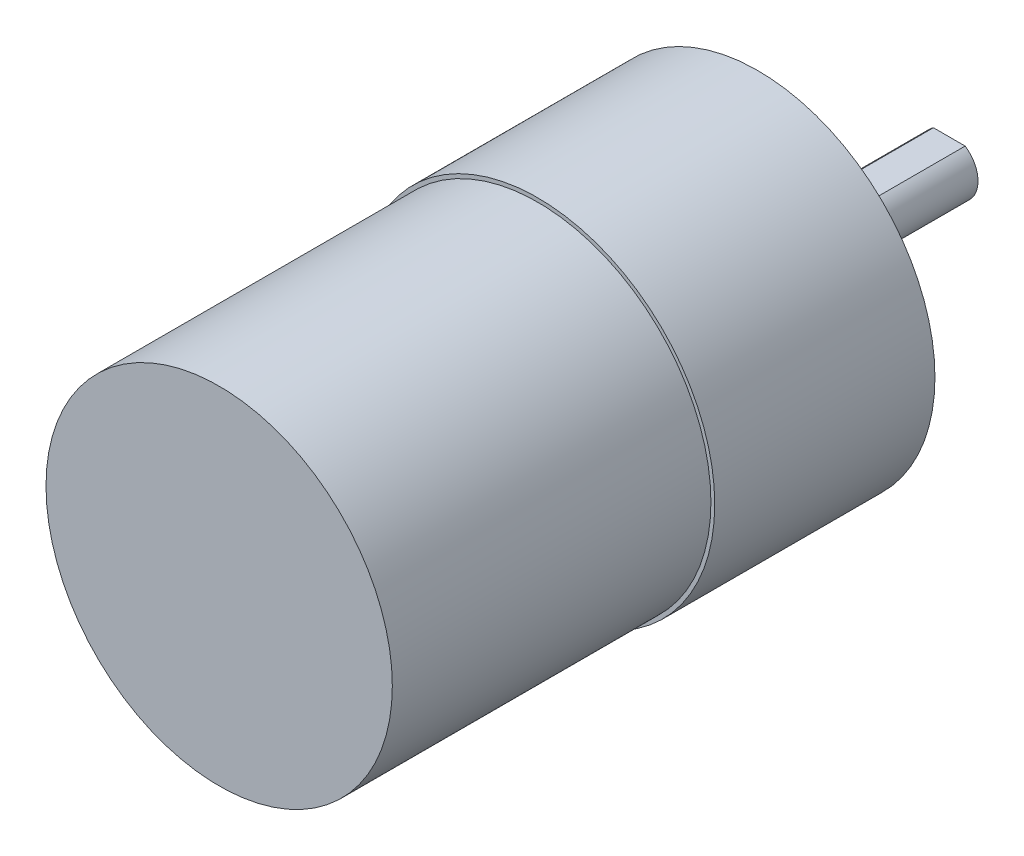
ISO-10303-21;
HEADER;
FILE_DESCRIPTION(('STEP AP214'),'2;1');
FILE_NAME('part.step','',(''),(''),'','','');
FILE_SCHEMA(('AUTOMOTIVE_DESIGN { 1 0 10303 214 1 1 1 1 }'));
ENDSEC;
DATA;
#1=APPLICATION_CONTEXT('core data for automotive mechanical design processes');
#2=APPLICATION_PROTOCOL_DEFINITION('international standard','automotive_design',2000,#1);
#3=PRODUCT_CONTEXT('',#1,'mechanical');
#4=PRODUCT('Part','Part','',(#3));
#5=PRODUCT_RELATED_PRODUCT_CATEGORY('part','',(#4));
#6=PRODUCT_DEFINITION_FORMATION('','',#4);
#7=PRODUCT_DEFINITION_CONTEXT('part definition',#1,'design');
#8=PRODUCT_DEFINITION('design','',#6,#7);
#9=PRODUCT_DEFINITION_SHAPE('','',#8);
#10=(LENGTH_UNIT() NAMED_UNIT(*) SI_UNIT(.MILLI.,.METRE.));
#11=(NAMED_UNIT(*) PLANE_ANGLE_UNIT() SI_UNIT($,.RADIAN.));
#12=(NAMED_UNIT(*) SI_UNIT($,.STERADIAN.) SOLID_ANGLE_UNIT());
#13=UNCERTAINTY_MEASURE_WITH_UNIT(LENGTH_MEASURE(1.E-05),#10,'distance_accuracy_value','');
#14=(GEOMETRIC_REPRESENTATION_CONTEXT(3) GLOBAL_UNCERTAINTY_ASSIGNED_CONTEXT((#13)) GLOBAL_UNIT_ASSIGNED_CONTEXT((#10,
#11,#12)) REPRESENTATION_CONTEXT('',''));
#15=CARTESIAN_POINT('',(0.,0.,0.));
#16=DIRECTION('',(0.,0.,1.));
#17=DIRECTION('',(1.,0.,0.));
#18=AXIS2_PLACEMENT_3D('',#15,#16,#17);
#19=CARTESIAN_POINT('',(0.,0.,23.0161764705882));
#20=DIRECTION('',(0.,0.,-1.));
#21=DIRECTION('',(-1.,0.,0.));
#22=AXIS2_PLACEMENT_3D('',#19,#20,#21);
#23=CYLINDRICAL_SURFACE('',#22,18.5);
#24=CARTESIAN_POINT('',(0.,0.,23.0161764705882));
#25=DIRECTION('',(0.,0.,1.));
#26=DIRECTION('',(1.,0.,0.));
#27=AXIS2_PLACEMENT_3D('',#24,#25,#26);
#28=CIRCLE('',#27,18.5);
#29=CARTESIAN_POINT('',(18.5,0.,23.0161764705882));
#30=VERTEX_POINT('',#29);
#31=EDGE_CURVE('E89',#30,#30,#28,.T.);
#32=ORIENTED_EDGE('',*,*,#31,.F.);
#33=EDGE_LOOP('',(#32));
#34=FACE_BOUND('',#33,.T.);
#35=CARTESIAN_POINT('',(0.,0.,0.));
#36=DIRECTION('',(0.,0.,1.));
#37=DIRECTION('',(1.,0.,0.));
#38=AXIS2_PLACEMENT_3D('',#35,#36,#37);
#39=CIRCLE('',#38,18.5);
#40=CARTESIAN_POINT('',(18.5,0.,0.));
#41=VERTEX_POINT('',#40);
#42=EDGE_CURVE('E37',#41,#41,#39,.T.);
#43=ORIENTED_EDGE('',*,*,#42,.T.);
#44=EDGE_LOOP('',(#43));
#45=FACE_BOUND('',#44,.T.);
#46=ADVANCED_FACE('F34',(#34,#45),#23,.T.);
#47=CARTESIAN_POINT('',(0.,0.,23.0161764705882));
#48=DIRECTION('',(0.,0.,1.));
#49=DIRECTION('',(1.,0.,0.));
#50=AXIS2_PLACEMENT_3D('',#47,#48,#49);
#51=PLANE('',#50);
#52=CARTESIAN_POINT('',(0.,0.,23.0161764705882));
#53=DIRECTION('',(0.,0.,1.));
#54=DIRECTION('',(1.,0.,0.));
#55=AXIS2_PLACEMENT_3D('',#52,#53,#54);
#56=CIRCLE('',#55,18.1);
#57=CARTESIAN_POINT('',(18.1,0.,23.0161764705882));
#58=VERTEX_POINT('',#57);
#59=EDGE_CURVE('E85',#58,#58,#56,.T.);
#60=ORIENTED_EDGE('',*,*,#59,.F.);
#61=EDGE_LOOP('',(#60));
#62=FACE_BOUND('',#61,.T.);
#63=ORIENTED_EDGE('',*,*,#31,.T.);
#64=EDGE_LOOP('',(#63));
#65=FACE_BOUND('',#64,.T.);
#66=ADVANCED_FACE('F100',(#62,#65),#51,.T.);
#67=CARTESIAN_POINT('',(0.,0.,0.));
#68=DIRECTION('',(0.,0.,1.));
#69=DIRECTION('',(1.,0.,0.));
#70=AXIS2_PLACEMENT_3D('',#67,#68,#69);
#71=PLANE('',#70);
#72=CARTESIAN_POINT('',(7.75000000000009,13.4233937586581,0.));
#73=DIRECTION('',(0.,0.,-1.));
#74=DIRECTION('',(-1.,0.,0.));
#75=AXIS2_PLACEMENT_3D('',#72,#73,#74);
#76=CIRCLE('',#75,1.50000000000076);
#77=CARTESIAN_POINT('',(6.24999999999933,13.4233937586581,0.));
#78=VERTEX_POINT('',#77);
#79=EDGE_CURVE('E323',#78,#78,#76,.T.);
#80=ORIENTED_EDGE('',*,*,#79,.F.);
#81=EDGE_LOOP('',(#80));
#82=FACE_BOUND('',#81,.T.);
#83=CARTESIAN_POINT('',(15.4999999999994,-1.08176008225088E-12,0.));
#84=DIRECTION('',(0.,0.,-1.));
#85=DIRECTION('',(-1.,0.,0.));
#86=AXIS2_PLACEMENT_3D('',#83,#84,#85);
#87=CIRCLE('',#86,1.50000000000118);
#88=CARTESIAN_POINT('',(13.9999999999983,-1.08176008225088E-12,0.));
#89=VERTEX_POINT('',#88);
#90=EDGE_CURVE('E322',#89,#89,#87,.T.);
#91=ORIENTED_EDGE('',*,*,#90,.F.);
#92=EDGE_LOOP('',(#91));
#93=FACE_BOUND('',#92,.T.);
#94=CARTESIAN_POINT('',(7.74999999999879,-13.4233937586595,0.));
#95=DIRECTION('',(0.,0.,-1.));
#96=DIRECTION('',(-1.,0.,0.));
#97=AXIS2_PLACEMENT_3D('',#94,#95,#96);
#98=CIRCLE('',#97,1.50000000000096);
#99=CARTESIAN_POINT('',(6.24999999999783,-13.4233937586595,0.));
#100=VERTEX_POINT('',#99);
#101=EDGE_CURVE('E358',#100,#100,#98,.T.);
#102=ORIENTED_EDGE('',*,*,#101,.F.);
#103=EDGE_LOOP('',(#102));
#104=FACE_BOUND('',#103,.T.);
#105=CARTESIAN_POINT('',(-7.75000000000121,-13.4233937586588,0.));
#106=DIRECTION('',(0.,0.,-1.));
#107=DIRECTION('',(-1.,0.,0.));
#108=AXIS2_PLACEMENT_3D('',#105,#106,#107);
#109=CIRCLE('',#108,1.5000000000003);
#110=CARTESIAN_POINT('',(-9.25000000000151,-13.4233937586588,0.));
#111=VERTEX_POINT('',#110);
#112=EDGE_CURVE('E352',#111,#111,#109,.T.);
#113=ORIENTED_EDGE('',*,*,#112,.F.);
#114=EDGE_LOOP('',(#113));
#115=FACE_BOUND('',#114,.T.);
#116=CARTESIAN_POINT('',(-15.5000000000006,4.21937952614402E-13,0.));
#117=DIRECTION('',(0.,0.,-1.));
#118=DIRECTION('',(-1.,0.,0.));
#119=AXIS2_PLACEMENT_3D('',#116,#117,#118);
#120=CIRCLE('',#119,1.49999999999983);
#121=CARTESIAN_POINT('',(-17.0000000000004,4.21937952614402E-13,0.));
#122=VERTEX_POINT('',#121);
#123=EDGE_CURVE('E343',#122,#122,#120,.T.);
#124=ORIENTED_EDGE('',*,*,#123,.F.);
#125=EDGE_LOOP('',(#124));
#126=FACE_BOUND('',#125,.T.);
#127=CARTESIAN_POINT('',(-7.74999999999992,13.4233937586588,0.));
#128=DIRECTION('',(0.,0.,-1.));
#129=DIRECTION('',(-1.,0.,0.));
#130=AXIS2_PLACEMENT_3D('',#127,#128,#129);
#131=CIRCLE('',#130,1.5);
#132=CARTESIAN_POINT('',(-9.24999999999992,13.4233937586588,0.));
#133=VERTEX_POINT('',#132);
#134=EDGE_CURVE('E334',#133,#133,#131,.T.);
#135=ORIENTED_EDGE('',*,*,#134,.F.);
#136=EDGE_LOOP('',(#135));
#137=FACE_BOUND('',#136,.T.);
#138=CARTESIAN_POINT('',(0.,0.,0.));
#139=DIRECTION('',(0.,0.,-1.));
#140=DIRECTION('',(-1.,0.,0.));
#141=AXIS2_PLACEMENT_3D('',#138,#139,#140);
#142=CIRCLE('',#141,6.);
#143=CARTESIAN_POINT('',(-6.,0.,0.));
#144=VERTEX_POINT('',#143);
#145=EDGE_CURVE('E42',#144,#144,#142,.T.);
#146=ORIENTED_EDGE('',*,*,#145,.F.);
#147=EDGE_LOOP('',(#146));
#148=FACE_BOUND('',#147,.T.);
#149=ORIENTED_EDGE('',*,*,#42,.F.);
#150=EDGE_LOOP('',(#149));
#151=FACE_BOUND('',#150,.T.);
#152=ADVANCED_FACE('F97',(#82,#93,#104,#115,#126,#137,#148,#151),#71,.F.);
#153=CARTESIAN_POINT('',(0.,0.,56.3161764705882));
#154=DIRECTION('',(0.,0.,-1.));
#155=DIRECTION('',(-1.,0.,0.));
#156=AXIS2_PLACEMENT_3D('',#153,#154,#155);
#157=CYLINDRICAL_SURFACE('',#156,18.1);
#158=CARTESIAN_POINT('',(0.,0.,56.3161764705882));
#159=DIRECTION('',(0.,0.,1.));
#160=DIRECTION('',(1.,0.,0.));
#161=AXIS2_PLACEMENT_3D('',#158,#159,#160);
#162=CIRCLE('',#161,18.1);
#163=CARTESIAN_POINT('',(18.1,0.,56.3161764705882));
#164=VERTEX_POINT('',#163);
#165=EDGE_CURVE('E79',#164,#164,#162,.T.);
#166=ORIENTED_EDGE('',*,*,#165,.F.);
#167=EDGE_LOOP('',(#166));
#168=FACE_BOUND('',#167,.T.);
#169=ORIENTED_EDGE('',*,*,#59,.T.);
#170=EDGE_LOOP('',(#169));
#171=FACE_BOUND('',#170,.T.);
#172=ADVANCED_FACE('F99',(#168,#171),#157,.T.);
#173=CARTESIAN_POINT('',(0.,0.,56.3161764705882));
#174=DIRECTION('',(0.,0.,1.));
#175=DIRECTION('',(1.,0.,0.));
#176=AXIS2_PLACEMENT_3D('',#173,#174,#175);
#177=PLANE('',#176);
#178=ORIENTED_EDGE('',*,*,#165,.T.);
#179=EDGE_LOOP('',(#178));
#180=FACE_BOUND('',#179,.T.);
#181=ADVANCED_FACE('F106',(#180),#177,.T.);
#182=CARTESIAN_POINT('',(0.,0.,-5.));
#183=DIRECTION('',(0.,0.,1.));
#184=DIRECTION('',(1.,0.,0.));
#185=AXIS2_PLACEMENT_3D('',#182,#183,#184);
#186=CYLINDRICAL_SURFACE('',#185,6.);
#187=CARTESIAN_POINT('',(0.,0.,-5.));
#188=DIRECTION('',(0.,0.,-1.));
#189=DIRECTION('',(-1.,0.,0.));
#190=AXIS2_PLACEMENT_3D('',#187,#188,#189);
#191=CIRCLE('',#190,6.);
#192=CARTESIAN_POINT('',(-6.,0.,-5.));
#193=VERTEX_POINT('',#192);
#194=EDGE_CURVE('E76',#193,#193,#191,.T.);
#195=ORIENTED_EDGE('',*,*,#194,.F.);
#196=EDGE_LOOP('',(#195));
#197=FACE_BOUND('',#196,.T.);
#198=ORIENTED_EDGE('',*,*,#145,.T.);
#199=EDGE_LOOP('',(#198));
#200=FACE_BOUND('',#199,.T.);
#201=ADVANCED_FACE('F137',(#197,#200),#186,.T.);
#202=CARTESIAN_POINT('',(0.,0.,-5.));
#203=DIRECTION('',(0.,0.,-1.));
#204=DIRECTION('',(-1.,0.,0.));
#205=AXIS2_PLACEMENT_3D('',#202,#203,#204);
#206=PLANE('',#205);
#207=CARTESIAN_POINT('',(0.,0.,-5.));
#208=DIRECTION('',(0.,0.,-1.));
#209=DIRECTION('',(-1.,0.,0.));
#210=AXIS2_PLACEMENT_3D('',#207,#208,#209);
#211=CIRCLE('',#210,3.);
#212=CARTESIAN_POINT('',(-3.,0.,-5.));
#213=VERTEX_POINT('',#212);
#214=EDGE_CURVE('E11',#213,#213,#211,.T.);
#215=ORIENTED_EDGE('',*,*,#214,.F.);
#216=EDGE_LOOP('',(#215));
#217=FACE_BOUND('',#216,.T.);
#218=ORIENTED_EDGE('',*,*,#194,.T.);
#219=EDGE_LOOP('',(#218));
#220=FACE_BOUND('',#219,.T.);
#221=ADVANCED_FACE('F147',(#217,#220),#206,.T.);
#222=CARTESIAN_POINT('',(0.,0.,-20.));
#223=DIRECTION('',(0.,0.,1.));
#224=DIRECTION('',(1.,0.,0.));
#225=AXIS2_PLACEMENT_3D('',#222,#223,#224);
#226=CYLINDRICAL_SURFACE('',#225,3.);
#227=CARTESIAN_POINT('',(0.,0.,-20.));
#228=DIRECTION('',(0.,0.,-1.));
#229=DIRECTION('',(1.,0.,0.));
#230=AXIS2_PLACEMENT_3D('',#227,#228,#229);
#231=CIRCLE('',#230,3.);
#232=CARTESIAN_POINT('',(1.6583123951777,2.5,-20.));
#233=VERTEX_POINT('',#232);
#234=CARTESIAN_POINT('',(-1.6583123951777,2.5,-20.));
#235=VERTEX_POINT('',#234);
#236=EDGE_CURVE('E73',#233,#235,#231,.T.);
#237=ORIENTED_EDGE('',*,*,#236,.F.);
#238=DIRECTION('',(0.,0.,-1.));
#239=VECTOR('',#238,1.);
#240=CARTESIAN_POINT('',(1.6583123951777,2.5,-6.));
#241=LINE('',#240,#239);
#242=CARTESIAN_POINT('',(1.6583123951777,2.5,-6.));
#243=VERTEX_POINT('',#242);
#244=EDGE_CURVE('E50',#243,#233,#241,.T.);
#245=ORIENTED_EDGE('',*,*,#244,.F.);
#246=CARTESIAN_POINT('',(0.,0.,-6.));
#247=DIRECTION('',(0.,0.,-1.));
#248=DIRECTION('',(-1.,0.,0.));
#249=AXIS2_PLACEMENT_3D('',#246,#247,#248);
#250=CIRCLE('',#249,3.);
#251=CARTESIAN_POINT('',(-1.6583123951777,2.5,-6.));
#252=VERTEX_POINT('',#251);
#253=EDGE_CURVE('E66',#252,#243,#250,.T.);
#254=ORIENTED_EDGE('',*,*,#253,.F.);
#255=DIRECTION('',(0.,0.,-1.));
#256=VECTOR('',#255,1.);
#257=CARTESIAN_POINT('',(-1.6583123951777,2.5,-6.));
#258=LINE('',#257,#256);
#259=EDGE_CURVE('E56',#252,#235,#258,.T.);
#260=ORIENTED_EDGE('',*,*,#259,.T.);
#261=EDGE_LOOP('',(#237,#245,#254,#260));
#262=FACE_BOUND('',#261,.T.);
#263=ORIENTED_EDGE('',*,*,#214,.T.);
#264=EDGE_LOOP('',(#263));
#265=FACE_BOUND('',#264,.T.);
#266=ADVANCED_FACE('F71',(#262,#265),#226,.T.);
#267=CARTESIAN_POINT('',(0.,0.,-20.));
#268=DIRECTION('',(0.,0.,1.));
#269=DIRECTION('',(1.,0.,0.));
#270=AXIS2_PLACEMENT_3D('',#267,#268,#269);
#271=PLANE('',#270);
#272=ORIENTED_EDGE('',*,*,#236,.T.);
#273=DIRECTION('',(-1.,0.,0.));
#274=VECTOR('',#273,1.);
#275=CARTESIAN_POINT('',(1.6583123951777,2.5,-20.));
#276=LINE('',#275,#274);
#277=EDGE_CURVE('E61',#233,#235,#276,.T.);
#278=ORIENTED_EDGE('',*,*,#277,.F.);
#279=EDGE_LOOP('',(#272,#278));
#280=FACE_BOUND('',#279,.T.);
#281=ADVANCED_FACE('F75',(#280),#271,.F.);
#282=CARTESIAN_POINT('',(1.6583123951777,2.5,-6.));
#283=DIRECTION('',(0.,-1.,0.));
#284=DIRECTION('',(0.,0.,-1.));
#285=AXIS2_PLACEMENT_3D('',#282,#283,#284);
#286=PLANE('',#285);
#287=ORIENTED_EDGE('',*,*,#277,.T.);
#288=ORIENTED_EDGE('',*,*,#259,.F.);
#289=DIRECTION('',(-1.,0.,0.));
#290=VECTOR('',#289,1.);
#291=CARTESIAN_POINT('',(1.6583123951777,2.5,-6.));
#292=LINE('',#291,#290);
#293=EDGE_CURVE('E339',#243,#252,#292,.T.);
#294=ORIENTED_EDGE('',*,*,#293,.F.);
#295=ORIENTED_EDGE('',*,*,#244,.T.);
#296=EDGE_LOOP('',(#287,#288,#294,#295));
#297=FACE_BOUND('',#296,.T.);
#298=ADVANCED_FACE('F62',(#297),#286,.F.);
#299=CARTESIAN_POINT('',(0.,0.,-6.));
#300=DIRECTION('',(0.,0.,-1.));
#301=DIRECTION('',(-1.,0.,0.));
#302=AXIS2_PLACEMENT_3D('',#299,#300,#301);
#303=PLANE('',#302);
#304=ORIENTED_EDGE('',*,*,#253,.T.);
#305=ORIENTED_EDGE('',*,*,#293,.T.);
#306=EDGE_LOOP('',(#304,#305));
#307=FACE_BOUND('',#306,.T.);
#308=ADVANCED_FACE('F183',(#307),#303,.T.);
#309=CARTESIAN_POINT('',(-7.74999999999992,13.4233937586588,8.));
#310=DIRECTION('',(0.,0.,-1.));
#311=DIRECTION('',(-1.,0.,0.));
#312=AXIS2_PLACEMENT_3D('',#309,#310,#311);
#313=CYLINDRICAL_SURFACE('',#312,1.5);
#314=CARTESIAN_POINT('',(-7.74999999999992,13.4233937586588,8.));
#315=DIRECTION('',(0.,0.,-1.));
#316=DIRECTION('',(-1.,0.,0.));
#317=AXIS2_PLACEMENT_3D('',#314,#315,#316);
#318=CIRCLE('',#317,1.5);
#319=CARTESIAN_POINT('',(-9.24999999999992,13.4233937586588,8.));
#320=VERTEX_POINT('',#319);
#321=EDGE_CURVE('E67',#320,#320,#318,.T.);
#322=ORIENTED_EDGE('',*,*,#321,.F.);
#323=EDGE_LOOP('',(#322));
#324=FACE_BOUND('',#323,.T.);
#325=ORIENTED_EDGE('',*,*,#134,.T.);
#326=EDGE_LOOP('',(#325));
#327=FACE_BOUND('',#326,.T.);
#328=ADVANCED_FACE('F191',(#324,#327),#313,.F.);
#329=CARTESIAN_POINT('',(-7.74999999999992,13.4233937586588,8.));
#330=DIRECTION('',(0.,0.,-1.));
#331=DIRECTION('',(-1.,0.,0.));
#332=AXIS2_PLACEMENT_3D('',#329,#330,#331);
#333=PLANE('',#332);
#334=ORIENTED_EDGE('',*,*,#321,.T.);
#335=EDGE_LOOP('',(#334));
#336=FACE_BOUND('',#335,.T.);
#337=ADVANCED_FACE('F205',(#336),#333,.T.);
#338=CARTESIAN_POINT('',(-15.5000000000006,4.21937952614402E-13,8.));
#339=DIRECTION('',(0.,0.,-1.));
#340=DIRECTION('',(-1.,0.,0.));
#341=AXIS2_PLACEMENT_3D('',#338,#339,#340);
#342=CYLINDRICAL_SURFACE('',#341,1.49999999999983);
#343=CARTESIAN_POINT('',(-15.5000000000006,4.21937952614402E-13,8.));
#344=DIRECTION('',(0.,0.,-1.));
#345=DIRECTION('',(-1.,0.,0.));
#346=AXIS2_PLACEMENT_3D('',#343,#344,#345);
#347=CIRCLE('',#346,1.49999999999983);
#348=CARTESIAN_POINT('',(-17.0000000000004,4.21937952614402E-13,8.));
#349=VERTEX_POINT('',#348);
#350=EDGE_CURVE('E337',#349,#349,#347,.T.);
#351=ORIENTED_EDGE('',*,*,#350,.F.);
#352=EDGE_LOOP('',(#351));
#353=FACE_BOUND('',#352,.T.);
#354=ORIENTED_EDGE('',*,*,#123,.T.);
#355=EDGE_LOOP('',(#354));
#356=FACE_BOUND('',#355,.T.);
#357=ADVANCED_FACE('F215',(#353,#356),#342,.F.);
#358=CARTESIAN_POINT('',(-15.5000000000006,4.21937952614402E-13,8.));
#359=DIRECTION('',(0.,0.,-1.));
#360=DIRECTION('',(-1.,0.,0.));
#361=AXIS2_PLACEMENT_3D('',#358,#359,#360);
#362=PLANE('',#361);
#363=ORIENTED_EDGE('',*,*,#350,.T.);
#364=EDGE_LOOP('',(#363));
#365=FACE_BOUND('',#364,.T.);
#366=ADVANCED_FACE('F225',(#365),#362,.T.);
#367=CARTESIAN_POINT('',(-7.75000000000121,-13.4233937586588,8.));
#368=DIRECTION('',(0.,0.,-1.));
#369=DIRECTION('',(-1.,0.,0.));
#370=AXIS2_PLACEMENT_3D('',#367,#368,#369);
#371=CYLINDRICAL_SURFACE('',#370,1.5000000000003);
#372=CARTESIAN_POINT('',(-7.75000000000121,-13.4233937586588,8.));
#373=DIRECTION('',(0.,0.,-1.));
#374=DIRECTION('',(-1.,0.,0.));
#375=AXIS2_PLACEMENT_3D('',#372,#373,#374);
#376=CIRCLE('',#375,1.5000000000003);
#377=CARTESIAN_POINT('',(-9.25000000000151,-13.4233937586588,8.));
#378=VERTEX_POINT('',#377);
#379=EDGE_CURVE('E347',#378,#378,#376,.T.);
#380=ORIENTED_EDGE('',*,*,#379,.F.);
#381=EDGE_LOOP('',(#380));
#382=FACE_BOUND('',#381,.T.);
#383=ORIENTED_EDGE('',*,*,#112,.T.);
#384=EDGE_LOOP('',(#383));
#385=FACE_BOUND('',#384,.T.);
#386=ADVANCED_FACE('F235',(#382,#385),#371,.F.);
#387=CARTESIAN_POINT('',(-7.75000000000121,-13.4233937586588,8.));
#388=DIRECTION('',(0.,0.,-1.));
#389=DIRECTION('',(-1.,0.,0.));
#390=AXIS2_PLACEMENT_3D('',#387,#388,#389);
#391=PLANE('',#390);
#392=ORIENTED_EDGE('',*,*,#379,.T.);
#393=EDGE_LOOP('',(#392));
#394=FACE_BOUND('',#393,.T.);
#395=ADVANCED_FACE('F245',(#394),#391,.T.);
#396=CARTESIAN_POINT('',(7.74999999999879,-13.4233937586595,8.));
#397=DIRECTION('',(0.,0.,-1.));
#398=DIRECTION('',(-1.,0.,0.));
#399=AXIS2_PLACEMENT_3D('',#396,#397,#398);
#400=CYLINDRICAL_SURFACE('',#399,1.50000000000096);
#401=CARTESIAN_POINT('',(7.74999999999879,-13.4233937586595,8.));
#402=DIRECTION('',(0.,0.,-1.));
#403=DIRECTION('',(-1.,0.,0.));
#404=AXIS2_PLACEMENT_3D('',#401,#402,#403);
#405=CIRCLE('',#404,1.50000000000096);
#406=CARTESIAN_POINT('',(6.24999999999783,-13.4233937586595,8.));
#407=VERTEX_POINT('',#406);
#408=EDGE_CURVE('E355',#407,#407,#405,.T.);
#409=ORIENTED_EDGE('',*,*,#408,.F.);
#410=EDGE_LOOP('',(#409));
#411=FACE_BOUND('',#410,.T.);
#412=ORIENTED_EDGE('',*,*,#101,.T.);
#413=EDGE_LOOP('',(#412));
#414=FACE_BOUND('',#413,.T.);
#415=ADVANCED_FACE('F255',(#411,#414),#400,.F.);
#416=CARTESIAN_POINT('',(7.74999999999879,-13.4233937586595,8.));
#417=DIRECTION('',(0.,0.,-1.));
#418=DIRECTION('',(-1.,0.,0.));
#419=AXIS2_PLACEMENT_3D('',#416,#417,#418);
#420=PLANE('',#419);
#421=ORIENTED_EDGE('',*,*,#408,.T.);
#422=EDGE_LOOP('',(#421));
#423=FACE_BOUND('',#422,.T.);
#424=ADVANCED_FACE('F265',(#423),#420,.T.);
#425=CARTESIAN_POINT('',(15.4999999999994,-1.08176008225088E-12,8.));
#426=DIRECTION('',(0.,0.,-1.));
#427=DIRECTION('',(-1.,0.,0.));
#428=AXIS2_PLACEMENT_3D('',#425,#426,#427);
#429=CYLINDRICAL_SURFACE('',#428,1.50000000000118);
#430=CARTESIAN_POINT('',(15.4999999999994,-1.08176008225088E-12,8.));
#431=DIRECTION('',(0.,0.,-1.));
#432=DIRECTION('',(-1.,0.,0.));
#433=AXIS2_PLACEMENT_3D('',#430,#431,#432);
#434=CIRCLE('',#433,1.50000000000118);
#435=CARTESIAN_POINT('',(13.9999999999983,-1.08176008225088E-12,8.));
#436=VERTEX_POINT('',#435);
#437=EDGE_CURVE('E326',#436,#436,#434,.T.);
#438=ORIENTED_EDGE('',*,*,#437,.F.);
#439=EDGE_LOOP('',(#438));
#440=FACE_BOUND('',#439,.T.);
#441=ORIENTED_EDGE('',*,*,#90,.T.);
#442=EDGE_LOOP('',(#441));
#443=FACE_BOUND('',#442,.T.);
#444=ADVANCED_FACE('F275',(#440,#443),#429,.F.);
#445=CARTESIAN_POINT('',(15.4999999999994,-1.08176008225088E-12,8.));
#446=DIRECTION('',(0.,0.,-1.));
#447=DIRECTION('',(-1.,0.,0.));
#448=AXIS2_PLACEMENT_3D('',#445,#446,#447);
#449=PLANE('',#448);
#450=ORIENTED_EDGE('',*,*,#437,.T.);
#451=EDGE_LOOP('',(#450));
#452=FACE_BOUND('',#451,.T.);
#453=ADVANCED_FACE('F285',(#452),#449,.T.);
#454=CARTESIAN_POINT('',(7.75000000000009,13.4233937586581,8.));
#455=DIRECTION('',(0.,0.,-1.));
#456=DIRECTION('',(-1.,0.,0.));
#457=AXIS2_PLACEMENT_3D('',#454,#455,#456);
#458=CYLINDRICAL_SURFACE('',#457,1.50000000000076);
#459=CARTESIAN_POINT('',(7.75000000000009,13.4233937586581,8.));
#460=DIRECTION('',(0.,0.,-1.));
#461=DIRECTION('',(-1.,0.,0.));
#462=AXIS2_PLACEMENT_3D('',#459,#460,#461);
#463=CIRCLE('',#462,1.50000000000076);
#464=CARTESIAN_POINT('',(6.24999999999933,13.4233937586581,8.));
#465=VERTEX_POINT('',#464);
#466=EDGE_CURVE('E321',#465,#465,#463,.T.);
#467=ORIENTED_EDGE('',*,*,#466,.F.);
#468=EDGE_LOOP('',(#467));
#469=FACE_BOUND('',#468,.T.);
#470=ORIENTED_EDGE('',*,*,#79,.T.);
#471=EDGE_LOOP('',(#470));
#472=FACE_BOUND('',#471,.T.);
#473=ADVANCED_FACE('F295',(#469,#472),#458,.F.);
#474=CARTESIAN_POINT('',(7.75000000000009,13.4233937586581,8.));
#475=DIRECTION('',(0.,0.,-1.));
#476=DIRECTION('',(-1.,0.,0.));
#477=AXIS2_PLACEMENT_3D('',#474,#475,#476);
#478=PLANE('',#477);
#479=ORIENTED_EDGE('',*,*,#466,.T.);
#480=EDGE_LOOP('',(#479));
#481=FACE_BOUND('',#480,.T.);
#482=ADVANCED_FACE('F305',(#481),#478,.T.);
#483=CLOSED_SHELL('',(#46,#66,#152,#172,#181,#201,#221,#266,#281,#298,#308,#328,#337,#357,#366,
#386,#395,#415,#424,#444,#453,#473,#482));
#484=MANIFOLD_SOLID_BREP('B2',#483);
#485=ADVANCED_BREP_SHAPE_REPRESENTATION('',(#18,#484),#14);
#486=SHAPE_DEFINITION_REPRESENTATION(#9,#485);
ENDSEC;
END-ISO-10303-21;
